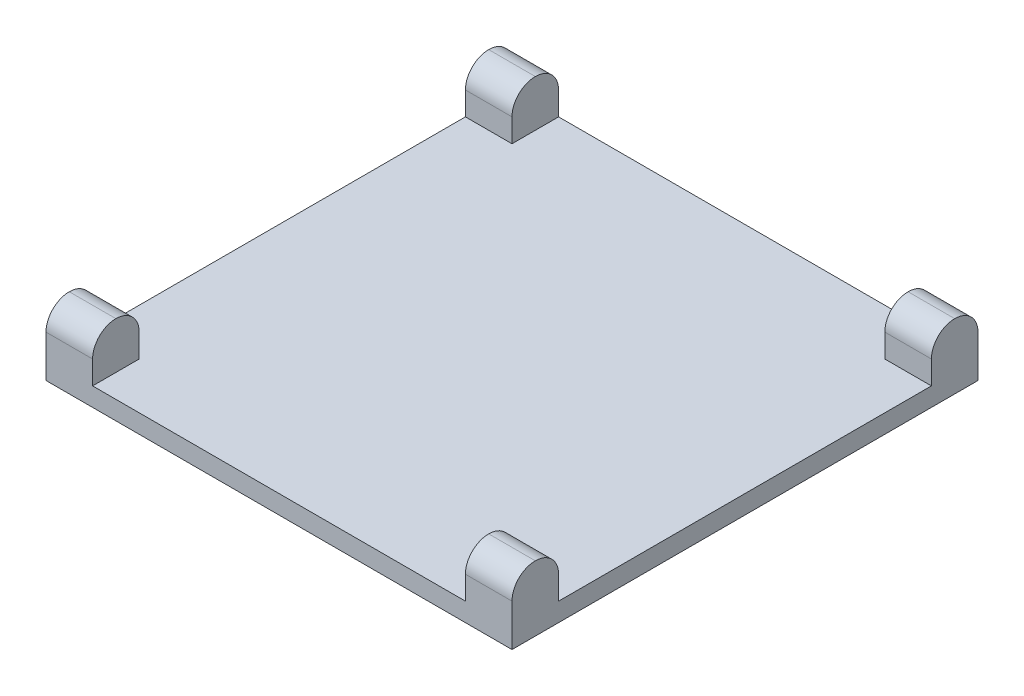
ISO-10303-21;
HEADER;
FILE_DESCRIPTION(('STEP AP214'),'2;1');
FILE_NAME('part.step','',(''),(''),'','','');
FILE_SCHEMA(('AUTOMOTIVE_DESIGN { 1 0 10303 214 1 1 1 1 }'));
ENDSEC;
DATA;
#1=APPLICATION_CONTEXT('core data for automotive mechanical design processes');
#2=APPLICATION_PROTOCOL_DEFINITION('international standard','automotive_design',2000,#1);
#3=PRODUCT_CONTEXT('',#1,'mechanical');
#4=PRODUCT('Part','Part','',(#3));
#5=PRODUCT_RELATED_PRODUCT_CATEGORY('part','',(#4));
#6=PRODUCT_DEFINITION_FORMATION('','',#4);
#7=PRODUCT_DEFINITION_CONTEXT('part definition',#1,'design');
#8=PRODUCT_DEFINITION('design','',#6,#7);
#9=PRODUCT_DEFINITION_SHAPE('','',#8);
#10=(LENGTH_UNIT() NAMED_UNIT(*) SI_UNIT(.MILLI.,.METRE.));
#11=(NAMED_UNIT(*) PLANE_ANGLE_UNIT() SI_UNIT($,.RADIAN.));
#12=(NAMED_UNIT(*) SI_UNIT($,.STERADIAN.) SOLID_ANGLE_UNIT());
#13=UNCERTAINTY_MEASURE_WITH_UNIT(LENGTH_MEASURE(1.E-05),#10,'distance_accuracy_value','');
#14=(GEOMETRIC_REPRESENTATION_CONTEXT(3) GLOBAL_UNCERTAINTY_ASSIGNED_CONTEXT((#13)) GLOBAL_UNIT_ASSIGNED_CONTEXT((#10,
#11,#12)) REPRESENTATION_CONTEXT('',''));
#15=CARTESIAN_POINT('',(0.,0.,0.));
#16=DIRECTION('',(0.,0.,1.));
#17=DIRECTION('',(1.,0.,0.));
#18=AXIS2_PLACEMENT_3D('',#15,#16,#17);
#19=CARTESIAN_POINT('',(0.,2.54,0.));
#20=DIRECTION('',(0.,-1.,0.));
#21=DIRECTION('',(0.,0.,-1.));
#22=AXIS2_PLACEMENT_3D('',#19,#20,#21);
#23=PLANE('',#22);
#24=DIRECTION('',(0.,0.,1.));
#25=VECTOR('',#24,1.);
#26=CARTESIAN_POINT('',(57.15,2.54,-63.5));
#27=LINE('',#26,#25);
#28=CARTESIAN_POINT('',(57.15,2.54,-63.5));
#29=VERTEX_POINT('',#28);
#30=CARTESIAN_POINT('',(57.15,2.54,-57.15));
#31=VERTEX_POINT('',#30);
#32=EDGE_CURVE('E180',#29,#31,#27,.T.);
#33=ORIENTED_EDGE('',*,*,#32,.F.);
#34=DIRECTION('',(-1.,0.,0.));
#35=VECTOR('',#34,1.);
#36=CARTESIAN_POINT('',(0.,2.54,-63.5));
#37=LINE('',#36,#35);
#38=CARTESIAN_POINT('',(6.35,2.54,-63.5));
#39=VERTEX_POINT('',#38);
#40=EDGE_CURVE('E191',#29,#39,#37,.T.);
#41=ORIENTED_EDGE('',*,*,#40,.T.);
#42=DIRECTION('',(0.,0.,-1.));
#43=VECTOR('',#42,1.);
#44=CARTESIAN_POINT('',(6.35,2.54,-63.5));
#45=LINE('',#44,#43);
#46=CARTESIAN_POINT('',(6.35,2.54,-57.15));
#47=VERTEX_POINT('',#46);
#48=EDGE_CURVE('E224',#47,#39,#45,.T.);
#49=ORIENTED_EDGE('',*,*,#48,.F.);
#50=DIRECTION('',(1.,0.,0.));
#51=VECTOR('',#50,1.);
#52=CARTESIAN_POINT('',(0.,2.54,-57.15));
#53=LINE('',#52,#51);
#54=CARTESIAN_POINT('',(0.,2.54,-57.15));
#55=VERTEX_POINT('',#54);
#56=EDGE_CURVE('E187',#55,#47,#53,.T.);
#57=ORIENTED_EDGE('',*,*,#56,.F.);
#58=DIRECTION('',(0.,0.,1.));
#59=VECTOR('',#58,1.);
#60=CARTESIAN_POINT('',(0.,2.54,0.));
#61=LINE('',#60,#59);
#62=CARTESIAN_POINT('',(0.,2.54,-6.35));
#63=VERTEX_POINT('',#62);
#64=EDGE_CURVE('E270',#55,#63,#61,.T.);
#65=ORIENTED_EDGE('',*,*,#64,.T.);
#66=DIRECTION('',(-1.,0.,0.));
#67=VECTOR('',#66,1.);
#68=CARTESIAN_POINT('',(0.,2.54,-6.35));
#69=LINE('',#68,#67);
#70=CARTESIAN_POINT('',(6.35,2.54,-6.35));
#71=VERTEX_POINT('',#70);
#72=EDGE_CURVE('E256',#71,#63,#69,.T.);
#73=ORIENTED_EDGE('',*,*,#72,.F.);
#74=DIRECTION('',(0.,0.,-1.));
#75=VECTOR('',#74,1.);
#76=CARTESIAN_POINT('',(6.35,2.54,0.));
#77=LINE('',#76,#75);
#78=CARTESIAN_POINT('',(6.35,2.54,0.));
#79=VERTEX_POINT('',#78);
#80=EDGE_CURVE('E252',#79,#71,#77,.T.);
#81=ORIENTED_EDGE('',*,*,#80,.F.);
#82=DIRECTION('',(1.,0.,0.));
#83=VECTOR('',#82,1.);
#84=CARTESIAN_POINT('',(0.,2.54,0.));
#85=LINE('',#84,#83);
#86=CARTESIAN_POINT('',(57.15,2.54,0.));
#87=VERTEX_POINT('',#86);
#88=EDGE_CURVE('E274',#79,#87,#85,.T.);
#89=ORIENTED_EDGE('',*,*,#88,.T.);
#90=DIRECTION('',(0.,0.,1.));
#91=VECTOR('',#90,1.);
#92=CARTESIAN_POINT('',(57.15,2.54,0.));
#93=LINE('',#92,#91);
#94=CARTESIAN_POINT('',(57.15,2.54,-6.35));
#95=VERTEX_POINT('',#94);
#96=EDGE_CURVE('E239',#95,#87,#93,.T.);
#97=ORIENTED_EDGE('',*,*,#96,.F.);
#98=DIRECTION('',(-1.,0.,0.));
#99=VECTOR('',#98,1.);
#100=CARTESIAN_POINT('',(63.5,2.54,-6.35));
#101=LINE('',#100,#99);
#102=CARTESIAN_POINT('',(63.5,2.54,-6.35));
#103=VERTEX_POINT('',#102);
#104=EDGE_CURVE('E235',#103,#95,#101,.T.);
#105=ORIENTED_EDGE('',*,*,#104,.F.);
#106=DIRECTION('',(0.,0.,-1.));
#107=VECTOR('',#106,1.);
#108=CARTESIAN_POINT('',(63.5,2.54,0.));
#109=LINE('',#108,#107);
#110=CARTESIAN_POINT('',(63.5,2.54,-57.15));
#111=VERTEX_POINT('',#110);
#112=EDGE_CURVE('E200',#103,#111,#109,.T.);
#113=ORIENTED_EDGE('',*,*,#112,.T.);
#114=DIRECTION('',(1.,0.,0.));
#115=VECTOR('',#114,1.);
#116=CARTESIAN_POINT('',(63.5,2.54,-57.15));
#117=LINE('',#116,#115);
#118=EDGE_CURVE('E205',#31,#111,#117,.T.);
#119=ORIENTED_EDGE('',*,*,#118,.F.);
#120=EDGE_LOOP('',(#33,#41,#49,#57,#65,#73,#81,#89,#97,#105,#113,#119));
#121=FACE_BOUND('',#120,.T.);
#122=ADVANCED_FACE('F39',(#121),#23,.F.);
#123=CARTESIAN_POINT('',(0.,2.54,0.));
#124=DIRECTION('',(1.,0.,0.));
#125=DIRECTION('',(0.,0.,-1.));
#126=AXIS2_PLACEMENT_3D('',#123,#124,#125);
#127=PLANE('',#126);
#128=CARTESIAN_POINT('',(0.,5.715,-3.175));
#129=DIRECTION('',(1.,0.,0.));
#130=DIRECTION('',(0.,0.,-1.));
#131=AXIS2_PLACEMENT_3D('',#128,#129,#130);
#132=CIRCLE('',#131,3.175);
#133=CARTESIAN_POINT('',(0.,5.715,0.));
#134=VERTEX_POINT('',#133);
#135=CARTESIAN_POINT('',(0.,8.89,-3.175));
#136=VERTEX_POINT('',#135);
#137=EDGE_CURVE('E312',#134,#136,#132,.F.);
#138=ORIENTED_EDGE('',*,*,#137,.T.);
#139=CARTESIAN_POINT('',(0.,5.715,-3.175));
#140=DIRECTION('',(1.,0.,0.));
#141=DIRECTION('',(0.,0.,-1.));
#142=AXIS2_PLACEMENT_3D('',#139,#140,#141);
#143=CIRCLE('',#142,3.175);
#144=CARTESIAN_POINT('',(0.,5.715,-6.35));
#145=VERTEX_POINT('',#144);
#146=EDGE_CURVE('E315',#136,#145,#143,.F.);
#147=ORIENTED_EDGE('',*,*,#146,.T.);
#148=DIRECTION('',(0.,-1.,0.));
#149=VECTOR('',#148,1.);
#150=CARTESIAN_POINT('',(0.,8.89,-6.35));
#151=LINE('',#150,#149);
#152=EDGE_CURVE('E260',#145,#63,#151,.T.);
#153=ORIENTED_EDGE('',*,*,#152,.T.);
#154=ORIENTED_EDGE('',*,*,#64,.F.);
#155=DIRECTION('',(0.,-1.,0.));
#156=VECTOR('',#155,1.);
#157=CARTESIAN_POINT('',(0.,8.89,-57.15));
#158=LINE('',#157,#156);
#159=CARTESIAN_POINT('',(0.,5.715,-57.15));
#160=VERTEX_POINT('',#159);
#161=EDGE_CURVE('E232',#160,#55,#158,.T.);
#162=ORIENTED_EDGE('',*,*,#161,.F.);
#163=CARTESIAN_POINT('',(0.,5.715,-60.325));
#164=DIRECTION('',(1.,0.,0.));
#165=DIRECTION('',(0.,0.,-1.));
#166=AXIS2_PLACEMENT_3D('',#163,#164,#165);
#167=CIRCLE('',#166,3.175);
#168=CARTESIAN_POINT('',(0.,8.89,-60.325));
#169=VERTEX_POINT('',#168);
#170=EDGE_CURVE('E306',#160,#169,#167,.F.);
#171=ORIENTED_EDGE('',*,*,#170,.T.);
#172=CARTESIAN_POINT('',(0.,5.715,-60.325));
#173=DIRECTION('',(1.,0.,0.));
#174=DIRECTION('',(0.,0.,-1.));
#175=AXIS2_PLACEMENT_3D('',#172,#173,#174);
#176=CIRCLE('',#175,3.175);
#177=CARTESIAN_POINT('',(0.,5.715,-63.5));
#178=VERTEX_POINT('',#177);
#179=EDGE_CURVE('E309',#169,#178,#176,.F.);
#180=ORIENTED_EDGE('',*,*,#179,.T.);
#181=DIRECTION('',(0.,-1.,0.));
#182=VECTOR('',#181,1.);
#183=CARTESIAN_POINT('',(0.,2.54,-63.5));
#184=LINE('',#183,#182);
#185=CARTESIAN_POINT('',(0.,0.,-63.5));
#186=VERTEX_POINT('',#185);
#187=EDGE_CURVE('E199',#178,#186,#184,.T.);
#188=ORIENTED_EDGE('',*,*,#187,.T.);
#189=DIRECTION('',(0.,0.,1.));
#190=VECTOR('',#189,1.);
#191=CARTESIAN_POINT('',(0.,0.,0.));
#192=LINE('',#191,#190);
#193=CARTESIAN_POINT('',(0.,0.,0.));
#194=VERTEX_POINT('',#193);
#195=EDGE_CURVE('E269',#186,#194,#192,.T.);
#196=ORIENTED_EDGE('',*,*,#195,.T.);
#197=DIRECTION('',(0.,-1.,0.));
#198=VECTOR('',#197,1.);
#199=CARTESIAN_POINT('',(0.,2.54,0.));
#200=LINE('',#199,#198);
#201=EDGE_CURVE('E303',#134,#194,#200,.T.);
#202=ORIENTED_EDGE('',*,*,#201,.F.);
#203=EDGE_LOOP('',(#138,#147,#153,#154,#162,#171,#180,#188,#196,#202));
#204=FACE_BOUND('',#203,.T.);
#205=ADVANCED_FACE('F397',(#204),#127,.F.);
#206=CARTESIAN_POINT('',(0.,2.54,0.));
#207=DIRECTION('',(0.,0.,-1.));
#208=DIRECTION('',(-1.,0.,0.));
#209=AXIS2_PLACEMENT_3D('',#206,#207,#208);
#210=PLANE('',#209);
#211=DIRECTION('',(0.,-1.,0.));
#212=VECTOR('',#211,1.);
#213=CARTESIAN_POINT('',(6.35,8.89,0.));
#214=LINE('',#213,#212);
#215=CARTESIAN_POINT('',(6.35,5.715,0.));
#216=VERTEX_POINT('',#215);
#217=EDGE_CURVE('E266',#216,#79,#214,.T.);
#218=ORIENTED_EDGE('',*,*,#217,.F.);
#219=DIRECTION('',(1.,0.,0.));
#220=VECTOR('',#219,1.);
#221=CARTESIAN_POINT('',(0.,5.715,0.));
#222=LINE('',#221,#220);
#223=EDGE_CURVE('E332',#216,#134,#222,.F.);
#224=ORIENTED_EDGE('',*,*,#223,.T.);
#225=ORIENTED_EDGE('',*,*,#201,.T.);
#226=DIRECTION('',(1.,0.,0.));
#227=VECTOR('',#226,1.);
#228=CARTESIAN_POINT('',(0.,0.,0.));
#229=LINE('',#228,#227);
#230=CARTESIAN_POINT('',(63.5,0.,0.));
#231=VERTEX_POINT('',#230);
#232=EDGE_CURVE('E284',#194,#231,#229,.T.);
#233=ORIENTED_EDGE('',*,*,#232,.T.);
#234=DIRECTION('',(0.,-1.,0.));
#235=VECTOR('',#234,1.);
#236=CARTESIAN_POINT('',(63.5,2.54,0.));
#237=LINE('',#236,#235);
#238=CARTESIAN_POINT('',(63.5,5.715,0.));
#239=VERTEX_POINT('',#238);
#240=EDGE_CURVE('E300',#239,#231,#237,.T.);
#241=ORIENTED_EDGE('',*,*,#240,.F.);
#242=DIRECTION('',(1.,0.,0.));
#243=VECTOR('',#242,1.);
#244=CARTESIAN_POINT('',(57.15,5.715,0.));
#245=LINE('',#244,#243);
#246=CARTESIAN_POINT('',(57.15,5.715,0.));
#247=VERTEX_POINT('',#246);
#248=EDGE_CURVE('E328',#239,#247,#245,.F.);
#249=ORIENTED_EDGE('',*,*,#248,.T.);
#250=DIRECTION('',(0.,-1.,0.));
#251=VECTOR('',#250,1.);
#252=CARTESIAN_POINT('',(57.15,8.89,0.));
#253=LINE('',#252,#251);
#254=EDGE_CURVE('E243',#247,#87,#253,.T.);
#255=ORIENTED_EDGE('',*,*,#254,.T.);
#256=ORIENTED_EDGE('',*,*,#88,.F.);
#257=EDGE_LOOP('',(#218,#224,#225,#233,#241,#249,#255,#256));
#258=FACE_BOUND('',#257,.T.);
#259=ADVANCED_FACE('F412',(#258),#210,.F.);
#260=CARTESIAN_POINT('',(63.5,2.54,0.));
#261=DIRECTION('',(-1.,0.,0.));
#262=DIRECTION('',(0.,0.,1.));
#263=AXIS2_PLACEMENT_3D('',#260,#261,#262);
#264=PLANE('',#263);
#265=CARTESIAN_POINT('',(63.5,5.715,-3.175));
#266=DIRECTION('',(-1.,0.,0.));
#267=DIRECTION('',(0.,0.,1.));
#268=AXIS2_PLACEMENT_3D('',#265,#266,#267);
#269=CIRCLE('',#268,3.175);
#270=CARTESIAN_POINT('',(63.5,5.715,-6.35));
#271=VERTEX_POINT('',#270);
#272=CARTESIAN_POINT('',(63.5,8.89,-3.175));
#273=VERTEX_POINT('',#272);
#274=EDGE_CURVE('E341',#271,#273,#269,.F.);
#275=ORIENTED_EDGE('',*,*,#274,.T.);
#276=CARTESIAN_POINT('',(63.5,5.715,-3.175));
#277=DIRECTION('',(-1.,0.,0.));
#278=DIRECTION('',(0.,0.,1.));
#279=AXIS2_PLACEMENT_3D('',#276,#277,#278);
#280=CIRCLE('',#279,3.175);
#281=EDGE_CURVE('E344',#273,#239,#280,.F.);
#282=ORIENTED_EDGE('',*,*,#281,.T.);
#283=ORIENTED_EDGE('',*,*,#240,.T.);
#284=DIRECTION('',(0.,0.,-1.));
#285=VECTOR('',#284,1.);
#286=CARTESIAN_POINT('',(63.5,0.,0.));
#287=LINE('',#286,#285);
#288=CARTESIAN_POINT('',(63.5,0.,-63.5));
#289=VERTEX_POINT('',#288);
#290=EDGE_CURVE('E288',#231,#289,#287,.T.);
#291=ORIENTED_EDGE('',*,*,#290,.T.);
#292=DIRECTION('',(0.,-1.,0.));
#293=VECTOR('',#292,1.);
#294=CARTESIAN_POINT('',(63.5,2.54,-63.5));
#295=LINE('',#294,#293);
#296=CARTESIAN_POINT('',(63.5,5.715,-63.5));
#297=VERTEX_POINT('',#296);
#298=EDGE_CURVE('E297',#297,#289,#295,.T.);
#299=ORIENTED_EDGE('',*,*,#298,.F.);
#300=CARTESIAN_POINT('',(63.5,5.715,-60.325));
#301=DIRECTION('',(-1.,0.,0.));
#302=DIRECTION('',(0.,0.,1.));
#303=AXIS2_PLACEMENT_3D('',#300,#301,#302);
#304=CIRCLE('',#303,3.175);
#305=CARTESIAN_POINT('',(63.5,8.89,-60.325));
#306=VERTEX_POINT('',#305);
#307=EDGE_CURVE('E338',#297,#306,#304,.F.);
#308=ORIENTED_EDGE('',*,*,#307,.T.);
#309=CARTESIAN_POINT('',(63.5,5.715,-60.325));
#310=DIRECTION('',(-1.,0.,0.));
#311=DIRECTION('',(0.,0.,1.));
#312=AXIS2_PLACEMENT_3D('',#309,#310,#311);
#313=CIRCLE('',#312,3.175);
#314=CARTESIAN_POINT('',(63.5,5.715,-57.15));
#315=VERTEX_POINT('',#314);
#316=EDGE_CURVE('E335',#306,#315,#313,.F.);
#317=ORIENTED_EDGE('',*,*,#316,.T.);
#318=DIRECTION('',(0.,-1.,0.));
#319=VECTOR('',#318,1.);
#320=CARTESIAN_POINT('',(63.5,8.89,-57.15));
#321=LINE('',#320,#319);
#322=EDGE_CURVE('E211',#315,#111,#321,.T.);
#323=ORIENTED_EDGE('',*,*,#322,.T.);
#324=ORIENTED_EDGE('',*,*,#112,.F.);
#325=DIRECTION('',(0.,-1.,0.));
#326=VECTOR('',#325,1.);
#327=CARTESIAN_POINT('',(63.5,8.89,-6.35));
#328=LINE('',#327,#326);
#329=EDGE_CURVE('E249',#271,#103,#328,.T.);
#330=ORIENTED_EDGE('',*,*,#329,.F.);
#331=EDGE_LOOP('',(#275,#282,#283,#291,#299,#308,#317,#323,#324,#330));
#332=FACE_BOUND('',#331,.T.);
#333=ADVANCED_FACE('F429',(#332),#264,.F.);
#334=CARTESIAN_POINT('',(0.,2.54,-63.5));
#335=DIRECTION('',(0.,0.,1.));
#336=DIRECTION('',(1.,0.,0.));
#337=AXIS2_PLACEMENT_3D('',#334,#335,#336);
#338=PLANE('',#337);
#339=DIRECTION('',(0.,-1.,0.));
#340=VECTOR('',#339,1.);
#341=CARTESIAN_POINT('',(57.15,8.89,-63.5));
#342=LINE('',#341,#340);
#343=CARTESIAN_POINT('',(57.15,5.715,-63.5));
#344=VERTEX_POINT('',#343);
#345=EDGE_CURVE('E175',#344,#29,#342,.T.);
#346=ORIENTED_EDGE('',*,*,#345,.F.);
#347=DIRECTION('',(-1.,0.,0.));
#348=VECTOR('',#347,1.);
#349=CARTESIAN_POINT('',(0.,5.715,-63.5));
#350=LINE('',#349,#348);
#351=EDGE_CURVE('E364',#344,#297,#350,.F.);
#352=ORIENTED_EDGE('',*,*,#351,.T.);
#353=ORIENTED_EDGE('',*,*,#298,.T.);
#354=DIRECTION('',(-1.,0.,0.));
#355=VECTOR('',#354,1.);
#356=CARTESIAN_POINT('',(0.,0.,-63.5));
#357=LINE('',#356,#355);
#358=EDGE_CURVE('E275',#289,#186,#357,.T.);
#359=ORIENTED_EDGE('',*,*,#358,.T.);
#360=ORIENTED_EDGE('',*,*,#187,.F.);
#361=DIRECTION('',(-1.,0.,0.));
#362=VECTOR('',#361,1.);
#363=CARTESIAN_POINT('',(6.35,5.715,-63.5));
#364=LINE('',#363,#362);
#365=CARTESIAN_POINT('',(6.35,5.715,-63.5));
#366=VERTEX_POINT('',#365);
#367=EDGE_CURVE('E361',#178,#366,#364,.F.);
#368=ORIENTED_EDGE('',*,*,#367,.T.);
#369=DIRECTION('',(0.,-1.,0.));
#370=VECTOR('',#369,1.);
#371=CARTESIAN_POINT('',(6.35,8.89,-63.5));
#372=LINE('',#371,#370);
#373=EDGE_CURVE('E194',#366,#39,#372,.T.);
#374=ORIENTED_EDGE('',*,*,#373,.T.);
#375=ORIENTED_EDGE('',*,*,#40,.F.);
#376=EDGE_LOOP('',(#346,#352,#353,#359,#360,#368,#374,#375));
#377=FACE_BOUND('',#376,.T.);
#378=ADVANCED_FACE('F192',(#377),#338,.F.);
#379=CARTESIAN_POINT('',(0.,0.,0.));
#380=DIRECTION('',(0.,-1.,0.));
#381=DIRECTION('',(0.,0.,-1.));
#382=AXIS2_PLACEMENT_3D('',#379,#380,#381);
#383=PLANE('',#382);
#384=ORIENTED_EDGE('',*,*,#195,.F.);
#385=ORIENTED_EDGE('',*,*,#358,.F.);
#386=ORIENTED_EDGE('',*,*,#290,.F.);
#387=ORIENTED_EDGE('',*,*,#232,.F.);
#388=EDGE_LOOP('',(#384,#385,#386,#387));
#389=FACE_BOUND('',#388,.T.);
#390=ADVANCED_FACE('F445',(#389),#383,.T.);
#391=CARTESIAN_POINT('',(6.35,8.89,0.));
#392=DIRECTION('',(-1.,0.,0.));
#393=DIRECTION('',(0.,0.,1.));
#394=AXIS2_PLACEMENT_3D('',#391,#392,#393);
#395=PLANE('',#394);
#396=DIRECTION('',(0.,-1.,0.));
#397=VECTOR('',#396,1.);
#398=CARTESIAN_POINT('',(6.35,8.89,-6.35));
#399=LINE('',#398,#397);
#400=CARTESIAN_POINT('',(6.35,5.715,-6.35));
#401=VERTEX_POINT('',#400);
#402=EDGE_CURVE('E263',#401,#71,#399,.T.);
#403=ORIENTED_EDGE('',*,*,#402,.F.);
#404=CARTESIAN_POINT('',(6.35,5.715,-3.175));
#405=DIRECTION('',(-1.,0.,0.));
#406=DIRECTION('',(0.,0.,1.));
#407=AXIS2_PLACEMENT_3D('',#404,#405,#406);
#408=CIRCLE('',#407,3.175);
#409=CARTESIAN_POINT('',(6.35,8.89,-3.175));
#410=VERTEX_POINT('',#409);
#411=EDGE_CURVE('E325',#401,#410,#408,.F.);
#412=ORIENTED_EDGE('',*,*,#411,.T.);
#413=CARTESIAN_POINT('',(6.35,5.715,-3.175));
#414=DIRECTION('',(-1.,0.,0.));
#415=DIRECTION('',(0.,0.,1.));
#416=AXIS2_PLACEMENT_3D('',#413,#414,#415);
#417=CIRCLE('',#416,3.175);
#418=EDGE_CURVE('E322',#410,#216,#417,.F.);
#419=ORIENTED_EDGE('',*,*,#418,.T.);
#420=ORIENTED_EDGE('',*,*,#217,.T.);
#421=ORIENTED_EDGE('',*,*,#80,.T.);
#422=EDGE_LOOP('',(#403,#412,#419,#420,#421));
#423=FACE_BOUND('',#422,.T.);
#424=ADVANCED_FACE('F406',(#423),#395,.F.);
#425=CARTESIAN_POINT('',(0.,8.89,-6.35));
#426=DIRECTION('',(0.,0.,1.));
#427=DIRECTION('',(1.,0.,0.));
#428=AXIS2_PLACEMENT_3D('',#425,#426,#427);
#429=PLANE('',#428);
#430=ORIENTED_EDGE('',*,*,#152,.F.);
#431=DIRECTION('',(-1.,0.,0.));
#432=VECTOR('',#431,1.);
#433=CARTESIAN_POINT('',(0.,5.715,-6.35));
#434=LINE('',#433,#432);
#435=EDGE_CURVE('E318',#145,#401,#434,.F.);
#436=ORIENTED_EDGE('',*,*,#435,.T.);
#437=ORIENTED_EDGE('',*,*,#402,.T.);
#438=ORIENTED_EDGE('',*,*,#72,.T.);
#439=EDGE_LOOP('',(#430,#436,#437,#438));
#440=FACE_BOUND('',#439,.T.);
#441=ADVANCED_FACE('F402',(#440),#429,.F.);
#442=CARTESIAN_POINT('',(63.5,8.89,-6.35));
#443=DIRECTION('',(0.,0.,1.));
#444=DIRECTION('',(1.,0.,0.));
#445=AXIS2_PLACEMENT_3D('',#442,#443,#444);
#446=PLANE('',#445);
#447=DIRECTION('',(0.,-1.,0.));
#448=VECTOR('',#447,1.);
#449=CARTESIAN_POINT('',(57.15,8.89,-6.35));
#450=LINE('',#449,#448);
#451=CARTESIAN_POINT('',(57.15,5.715,-6.35));
#452=VERTEX_POINT('',#451);
#453=EDGE_CURVE('E246',#452,#95,#450,.T.);
#454=ORIENTED_EDGE('',*,*,#453,.F.);
#455=DIRECTION('',(-1.,0.,0.));
#456=VECTOR('',#455,1.);
#457=CARTESIAN_POINT('',(63.5,5.715,-6.35));
#458=LINE('',#457,#456);
#459=EDGE_CURVE('E353',#452,#271,#458,.F.);
#460=ORIENTED_EDGE('',*,*,#459,.T.);
#461=ORIENTED_EDGE('',*,*,#329,.T.);
#462=ORIENTED_EDGE('',*,*,#104,.T.);
#463=EDGE_LOOP('',(#454,#460,#461,#462));
#464=FACE_BOUND('',#463,.T.);
#465=ADVANCED_FACE('F423',(#464),#446,.F.);
#466=CARTESIAN_POINT('',(57.15,8.89,0.));
#467=DIRECTION('',(1.,0.,0.));
#468=DIRECTION('',(0.,0.,-1.));
#469=AXIS2_PLACEMENT_3D('',#466,#467,#468);
#470=PLANE('',#469);
#471=ORIENTED_EDGE('',*,*,#254,.F.);
#472=CARTESIAN_POINT('',(57.15,5.715,-3.175));
#473=DIRECTION('',(1.,0.,0.));
#474=DIRECTION('',(0.,0.,-1.));
#475=AXIS2_PLACEMENT_3D('',#472,#473,#474);
#476=CIRCLE('',#475,3.175);
#477=CARTESIAN_POINT('',(57.15,8.89,-3.175));
#478=VERTEX_POINT('',#477);
#479=EDGE_CURVE('E350',#247,#478,#476,.F.);
#480=ORIENTED_EDGE('',*,*,#479,.T.);
#481=CARTESIAN_POINT('',(57.15,5.715,-3.175));
#482=DIRECTION('',(1.,0.,0.));
#483=DIRECTION('',(0.,0.,-1.));
#484=AXIS2_PLACEMENT_3D('',#481,#482,#483);
#485=CIRCLE('',#484,3.175);
#486=EDGE_CURVE('E347',#478,#452,#485,.F.);
#487=ORIENTED_EDGE('',*,*,#486,.T.);
#488=ORIENTED_EDGE('',*,*,#453,.T.);
#489=ORIENTED_EDGE('',*,*,#96,.T.);
#490=EDGE_LOOP('',(#471,#480,#487,#488,#489));
#491=FACE_BOUND('',#490,.T.);
#492=ADVANCED_FACE('F418',(#491),#470,.F.);
#493=CARTESIAN_POINT('',(0.,8.89,-57.15));
#494=DIRECTION('',(0.,0.,-1.));
#495=DIRECTION('',(-1.,0.,0.));
#496=AXIS2_PLACEMENT_3D('',#493,#494,#495);
#497=PLANE('',#496);
#498=DIRECTION('',(0.,-1.,0.));
#499=VECTOR('',#498,1.);
#500=CARTESIAN_POINT('',(6.35,8.89,-57.15));
#501=LINE('',#500,#499);
#502=CARTESIAN_POINT('',(6.35,5.715,-57.15));
#503=VERTEX_POINT('',#502);
#504=EDGE_CURVE('E229',#503,#47,#501,.T.);
#505=ORIENTED_EDGE('',*,*,#504,.F.);
#506=DIRECTION('',(1.,0.,0.));
#507=VECTOR('',#506,1.);
#508=CARTESIAN_POINT('',(0.,5.715,-57.15));
#509=LINE('',#508,#507);
#510=EDGE_CURVE('E11',#503,#160,#509,.F.);
#511=ORIENTED_EDGE('',*,*,#510,.T.);
#512=ORIENTED_EDGE('',*,*,#161,.T.);
#513=ORIENTED_EDGE('',*,*,#56,.T.);
#514=EDGE_LOOP('',(#505,#511,#512,#513));
#515=FACE_BOUND('',#514,.T.);
#516=ADVANCED_FACE('F393',(#515),#497,.F.);
#517=CARTESIAN_POINT('',(6.35,8.89,-63.5));
#518=DIRECTION('',(-1.,0.,0.));
#519=DIRECTION('',(0.,0.,1.));
#520=AXIS2_PLACEMENT_3D('',#517,#518,#519);
#521=PLANE('',#520);
#522=ORIENTED_EDGE('',*,*,#373,.F.);
#523=CARTESIAN_POINT('',(6.35,5.715,-60.325));
#524=DIRECTION('',(-1.,0.,0.));
#525=DIRECTION('',(0.,0.,1.));
#526=AXIS2_PLACEMENT_3D('',#523,#524,#525);
#527=CIRCLE('',#526,3.175);
#528=CARTESIAN_POINT('',(6.35,8.89,-60.325));
#529=VERTEX_POINT('',#528);
#530=EDGE_CURVE('E49',#366,#529,#527,.F.);
#531=ORIENTED_EDGE('',*,*,#530,.T.);
#532=CARTESIAN_POINT('',(6.35,5.715,-60.325));
#533=DIRECTION('',(-1.,0.,0.));
#534=DIRECTION('',(0.,0.,1.));
#535=AXIS2_PLACEMENT_3D('',#532,#533,#534);
#536=CIRCLE('',#535,3.175);
#537=EDGE_CURVE('E57',#529,#503,#536,.F.);
#538=ORIENTED_EDGE('',*,*,#537,.T.);
#539=ORIENTED_EDGE('',*,*,#504,.T.);
#540=ORIENTED_EDGE('',*,*,#48,.T.);
#541=EDGE_LOOP('',(#522,#531,#538,#539,#540));
#542=FACE_BOUND('',#541,.T.);
#543=ADVANCED_FACE('F526',(#542),#521,.F.);
#544=CARTESIAN_POINT('',(57.15,8.89,-63.5));
#545=DIRECTION('',(1.,0.,0.));
#546=DIRECTION('',(0.,0.,-1.));
#547=AXIS2_PLACEMENT_3D('',#544,#545,#546);
#548=PLANE('',#547);
#549=CARTESIAN_POINT('',(57.15,5.715,-60.325));
#550=DIRECTION('',(1.,0.,0.));
#551=DIRECTION('',(0.,0.,-1.));
#552=AXIS2_PLACEMENT_3D('',#549,#550,#551);
#553=CIRCLE('',#552,3.175);
#554=CARTESIAN_POINT('',(57.15,5.715,-57.15));
#555=VERTEX_POINT('',#554);
#556=CARTESIAN_POINT('',(57.15,8.89,-60.325));
#557=VERTEX_POINT('',#556);
#558=EDGE_CURVE('E356',#555,#557,#553,.F.);
#559=ORIENTED_EDGE('',*,*,#558,.T.);
#560=CARTESIAN_POINT('',(57.15,5.715,-60.325));
#561=DIRECTION('',(1.,0.,0.));
#562=DIRECTION('',(0.,0.,-1.));
#563=AXIS2_PLACEMENT_3D('',#560,#561,#562);
#564=CIRCLE('',#563,3.175);
#565=EDGE_CURVE('E182',#557,#344,#564,.F.);
#566=ORIENTED_EDGE('',*,*,#565,.T.);
#567=ORIENTED_EDGE('',*,*,#345,.T.);
#568=ORIENTED_EDGE('',*,*,#32,.T.);
#569=DIRECTION('',(0.,-1.,0.));
#570=VECTOR('',#569,1.);
#571=CARTESIAN_POINT('',(57.15,8.89,-57.15));
#572=LINE('',#571,#570);
#573=EDGE_CURVE('E188',#555,#31,#572,.T.);
#574=ORIENTED_EDGE('',*,*,#573,.F.);
#575=EDGE_LOOP('',(#559,#566,#567,#568,#574));
#576=FACE_BOUND('',#575,.T.);
#577=ADVANCED_FACE('F177',(#576),#548,.F.);
#578=CARTESIAN_POINT('',(63.5,8.89,-57.15));
#579=DIRECTION('',(0.,0.,-1.));
#580=DIRECTION('',(-1.,0.,0.));
#581=AXIS2_PLACEMENT_3D('',#578,#579,#580);
#582=PLANE('',#581);
#583=ORIENTED_EDGE('',*,*,#322,.F.);
#584=DIRECTION('',(1.,0.,0.));
#585=VECTOR('',#584,1.);
#586=CARTESIAN_POINT('',(63.5,5.715,-57.15));
#587=LINE('',#586,#585);
#588=EDGE_CURVE('E367',#315,#555,#587,.F.);
#589=ORIENTED_EDGE('',*,*,#588,.T.);
#590=ORIENTED_EDGE('',*,*,#573,.T.);
#591=ORIENTED_EDGE('',*,*,#118,.T.);
#592=EDGE_LOOP('',(#583,#589,#590,#591));
#593=FACE_BOUND('',#592,.T.);
#594=ADVANCED_FACE('F432',(#593),#582,.F.);
#595=CARTESIAN_POINT('',(0.,5.715,-3.175));
#596=DIRECTION('',(1.,0.,0.));
#597=DIRECTION('',(0.,0.,-1.));
#598=AXIS2_PLACEMENT_3D('',#595,#596,#597);
#599=CYLINDRICAL_SURFACE('',#598,3.175);
#600=ORIENTED_EDGE('',*,*,#223,.F.);
#601=ORIENTED_EDGE('',*,*,#418,.F.);
#602=DIRECTION('',(1.,0.,0.));
#603=VECTOR('',#602,1.);
#604=CARTESIAN_POINT('',(0.,8.89,-3.175));
#605=LINE('',#604,#603);
#606=EDGE_CURVE('E207',#136,#410,#605,.T.);
#607=ORIENTED_EDGE('',*,*,#606,.F.);
#608=ORIENTED_EDGE('',*,*,#137,.F.);
#609=EDGE_LOOP('',(#600,#601,#607,#608));
#610=FACE_BOUND('',#609,.T.);
#611=ADVANCED_FACE('F451',(#610),#599,.T.);
#612=CARTESIAN_POINT('',(0.,5.715,-3.175));
#613=DIRECTION('',(-1.,0.,0.));
#614=DIRECTION('',(0.,0.,1.));
#615=AXIS2_PLACEMENT_3D('',#612,#613,#614);
#616=CYLINDRICAL_SURFACE('',#615,3.175);
#617=ORIENTED_EDGE('',*,*,#411,.F.);
#618=ORIENTED_EDGE('',*,*,#435,.F.);
#619=ORIENTED_EDGE('',*,*,#146,.F.);
#620=ORIENTED_EDGE('',*,*,#606,.T.);
#621=EDGE_LOOP('',(#617,#618,#619,#620));
#622=FACE_BOUND('',#621,.T.);
#623=ADVANCED_FACE('F454',(#622),#616,.T.);
#624=CARTESIAN_POINT('',(0.,5.715,-3.17499999999999));
#625=DIRECTION('',(1.,0.,0.));
#626=DIRECTION('',(0.,0.,-1.));
#627=AXIS2_PLACEMENT_3D('',#624,#625,#626);
#628=CYLINDRICAL_SURFACE('',#627,3.175);
#629=ORIENTED_EDGE('',*,*,#459,.F.);
#630=ORIENTED_EDGE('',*,*,#486,.F.);
#631=DIRECTION('',(-1.,0.,0.));
#632=VECTOR('',#631,1.);
#633=CARTESIAN_POINT('',(57.15,8.89,-3.175));
#634=LINE('',#633,#632);
#635=EDGE_CURVE('E214',#273,#478,#634,.T.);
#636=ORIENTED_EDGE('',*,*,#635,.F.);
#637=ORIENTED_EDGE('',*,*,#274,.F.);
#638=EDGE_LOOP('',(#629,#630,#636,#637));
#639=FACE_BOUND('',#638,.T.);
#640=ADVANCED_FACE('F456',(#639),#628,.T.);
#641=CARTESIAN_POINT('',(0.,5.715,-3.175));
#642=DIRECTION('',(-1.,0.,0.));
#643=DIRECTION('',(0.,0.,1.));
#644=AXIS2_PLACEMENT_3D('',#641,#642,#643);
#645=CYLINDRICAL_SURFACE('',#644,3.175);
#646=ORIENTED_EDGE('',*,*,#479,.F.);
#647=ORIENTED_EDGE('',*,*,#248,.F.);
#648=ORIENTED_EDGE('',*,*,#281,.F.);
#649=ORIENTED_EDGE('',*,*,#635,.T.);
#650=EDGE_LOOP('',(#646,#647,#648,#649));
#651=FACE_BOUND('',#650,.T.);
#652=ADVANCED_FACE('F462',(#651),#645,.T.);
#653=CARTESIAN_POINT('',(0.,5.715,-60.325));
#654=DIRECTION('',(1.,0.,0.));
#655=DIRECTION('',(0.,0.,-1.));
#656=AXIS2_PLACEMENT_3D('',#653,#654,#655);
#657=CYLINDRICAL_SURFACE('',#656,3.175);
#658=ORIENTED_EDGE('',*,*,#588,.F.);
#659=ORIENTED_EDGE('',*,*,#316,.F.);
#660=DIRECTION('',(1.,0.,0.));
#661=VECTOR('',#660,1.);
#662=CARTESIAN_POINT('',(0.,8.89,-60.325));
#663=LINE('',#662,#661);
#664=EDGE_CURVE('E376',#557,#306,#663,.T.);
#665=ORIENTED_EDGE('',*,*,#664,.F.);
#666=ORIENTED_EDGE('',*,*,#558,.F.);
#667=EDGE_LOOP('',(#658,#659,#665,#666));
#668=FACE_BOUND('',#667,.T.);
#669=ADVANCED_FACE('F436',(#668),#657,.T.);
#670=CARTESIAN_POINT('',(0.,5.715,-60.325));
#671=DIRECTION('',(-1.,0.,0.));
#672=DIRECTION('',(0.,0.,1.));
#673=AXIS2_PLACEMENT_3D('',#670,#671,#672);
#674=CYLINDRICAL_SURFACE('',#673,3.175);
#675=ORIENTED_EDGE('',*,*,#307,.F.);
#676=ORIENTED_EDGE('',*,*,#351,.F.);
#677=ORIENTED_EDGE('',*,*,#565,.F.);
#678=ORIENTED_EDGE('',*,*,#664,.T.);
#679=EDGE_LOOP('',(#675,#676,#677,#678));
#680=FACE_BOUND('',#679,.T.);
#681=ADVANCED_FACE('F438',(#680),#674,.T.);
#682=CARTESIAN_POINT('',(0.,5.715,-60.325));
#683=DIRECTION('',(-1.,0.,0.));
#684=DIRECTION('',(0.,0.,1.));
#685=AXIS2_PLACEMENT_3D('',#682,#683,#684);
#686=CYLINDRICAL_SURFACE('',#685,3.175);
#687=ORIENTED_EDGE('',*,*,#510,.F.);
#688=ORIENTED_EDGE('',*,*,#537,.F.);
#689=DIRECTION('',(1.,0.,0.));
#690=VECTOR('',#689,1.);
#691=CARTESIAN_POINT('',(6.35,8.89,-60.325));
#692=LINE('',#691,#690);
#693=EDGE_CURVE('E43',#169,#529,#692,.T.);
#694=ORIENTED_EDGE('',*,*,#693,.F.);
#695=ORIENTED_EDGE('',*,*,#170,.F.);
#696=EDGE_LOOP('',(#687,#688,#694,#695));
#697=FACE_BOUND('',#696,.T.);
#698=ADVANCED_FACE('F41',(#697),#686,.T.);
#699=CARTESIAN_POINT('',(0.,5.715,-60.325));
#700=DIRECTION('',(1.,0.,0.));
#701=DIRECTION('',(0.,0.,-1.));
#702=AXIS2_PLACEMENT_3D('',#699,#700,#701);
#703=CYLINDRICAL_SURFACE('',#702,3.175);
#704=ORIENTED_EDGE('',*,*,#530,.F.);
#705=ORIENTED_EDGE('',*,*,#367,.F.);
#706=ORIENTED_EDGE('',*,*,#179,.F.);
#707=ORIENTED_EDGE('',*,*,#693,.T.);
#708=EDGE_LOOP('',(#704,#705,#706,#707));
#709=FACE_BOUND('',#708,.T.);
#710=ADVANCED_FACE('F386',(#709),#703,.T.);
#711=CLOSED_SHELL('',(#122,#205,#259,#333,#378,#390,#424,#441,#465,#492,#516,#543,#577,#594,
#611,#623,#640,#652,#669,#681,#698,#710));
#712=MANIFOLD_SOLID_BREP('B2',#711);
#713=ADVANCED_BREP_SHAPE_REPRESENTATION('',(#18,#712),#14);
#714=SHAPE_DEFINITION_REPRESENTATION(#9,#713);
ENDSEC;
END-ISO-10303-21;
